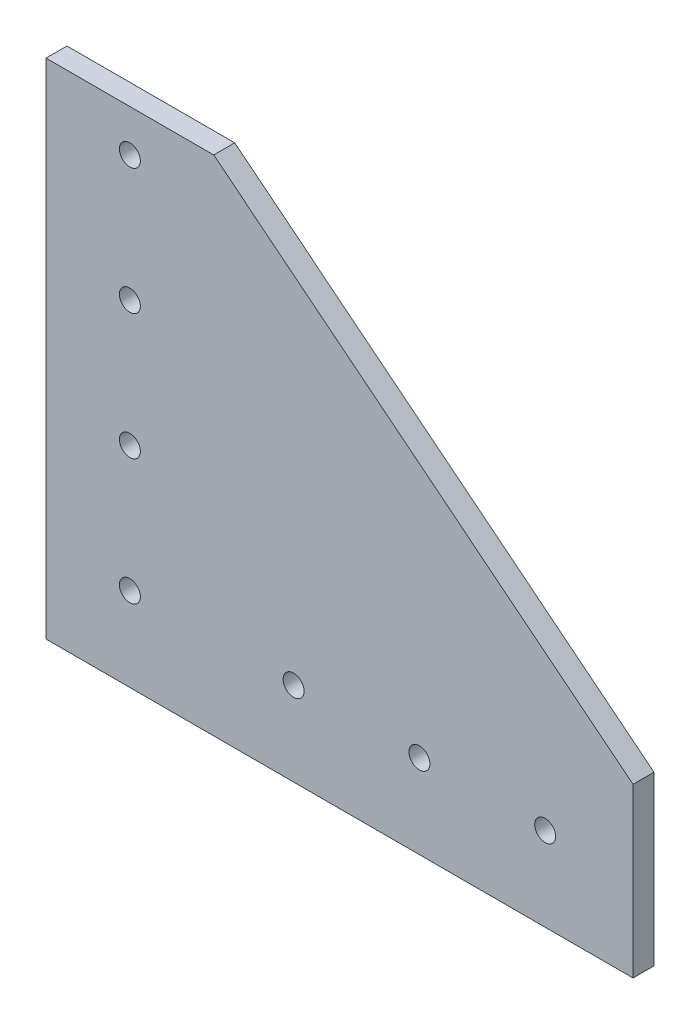
ISO-10303-21;
HEADER;
FILE_DESCRIPTION(('STEP AP214'),'2;1');
FILE_NAME('part.step','',(''),(''),'','','');
FILE_SCHEMA(('AUTOMOTIVE_DESIGN { 1 0 10303 214 1 1 1 1 }'));
ENDSEC;
DATA;
#1=APPLICATION_CONTEXT('core data for automotive mechanical design processes');
#2=APPLICATION_PROTOCOL_DEFINITION('international standard','automotive_design',2000,#1);
#3=PRODUCT_CONTEXT('',#1,'mechanical');
#4=PRODUCT('Part','Part','',(#3));
#5=PRODUCT_RELATED_PRODUCT_CATEGORY('part','',(#4));
#6=PRODUCT_DEFINITION_FORMATION('','',#4);
#7=PRODUCT_DEFINITION_CONTEXT('part definition',#1,'design');
#8=PRODUCT_DEFINITION('design','',#6,#7);
#9=PRODUCT_DEFINITION_SHAPE('','',#8);
#10=(LENGTH_UNIT() NAMED_UNIT(*) SI_UNIT(.MILLI.,.METRE.));
#11=(NAMED_UNIT(*) PLANE_ANGLE_UNIT() SI_UNIT($,.RADIAN.));
#12=(NAMED_UNIT(*) SI_UNIT($,.STERADIAN.) SOLID_ANGLE_UNIT());
#13=UNCERTAINTY_MEASURE_WITH_UNIT(LENGTH_MEASURE(1.E-05),#10,'distance_accuracy_value','');
#14=(GEOMETRIC_REPRESENTATION_CONTEXT(3) GLOBAL_UNCERTAINTY_ASSIGNED_CONTEXT((#13)) GLOBAL_UNIT_ASSIGNED_CONTEXT((#10,
#11,#12)) REPRESENTATION_CONTEXT('',''));
#15=CARTESIAN_POINT('',(0.,0.,0.));
#16=DIRECTION('',(0.,0.,1.));
#17=DIRECTION('',(1.,0.,0.));
#18=AXIS2_PLACEMENT_3D('',#15,#16,#17);
#19=CARTESIAN_POINT('',(-47.9900874948812,-35.0656392901018,3.175));
#20=DIRECTION('',(1.,0.,0.));
#21=DIRECTION('',(0.,1.,0.));
#22=AXIS2_PLACEMENT_3D('',#19,#20,#21);
#23=PLANE('',#22);
#24=DIRECTION('',(0.,-1.,0.));
#25=VECTOR('',#24,1.);
#26=CARTESIAN_POINT('',(-47.9900874948812,-35.0656392901018,0.));
#27=LINE('',#26,#25);
#28=CARTESIAN_POINT('',(-47.9900874948813,41.1343607098982,0.));
#29=VERTEX_POINT('',#28);
#30=CARTESIAN_POINT('',(-47.9900874948812,-35.0656392901018,0.));
#31=VERTEX_POINT('',#30);
#32=EDGE_CURVE('E112',#29,#31,#27,.T.);
#33=ORIENTED_EDGE('',*,*,#32,.T.);
#34=DIRECTION('',(0.,0.,-1.));
#35=VECTOR('',#34,1.);
#36=CARTESIAN_POINT('',(-47.9900874948812,-35.0656392901018,3.175));
#37=LINE('',#36,#35);
#38=CARTESIAN_POINT('',(-47.9900874948812,-35.0656392901018,3.175));
#39=VERTEX_POINT('',#38);
#40=EDGE_CURVE('E11',#39,#31,#37,.T.);
#41=ORIENTED_EDGE('',*,*,#40,.F.);
#42=DIRECTION('',(0.,-1.,0.));
#43=VECTOR('',#42,1.);
#44=CARTESIAN_POINT('',(-47.9900874948812,-35.0656392901018,3.175));
#45=LINE('',#44,#43);
#46=CARTESIAN_POINT('',(-47.9900874948813,41.1343607098982,3.175));
#47=VERTEX_POINT('',#46);
#48=EDGE_CURVE('E121',#47,#39,#45,.T.);
#49=ORIENTED_EDGE('',*,*,#48,.F.);
#50=DIRECTION('',(0.,0.,-1.));
#51=VECTOR('',#50,1.);
#52=CARTESIAN_POINT('',(-47.9900874948813,41.1343607098982,3.175));
#53=LINE('',#52,#51);
#54=EDGE_CURVE('E108',#47,#29,#53,.T.);
#55=ORIENTED_EDGE('',*,*,#54,.T.);
#56=EDGE_LOOP('',(#33,#41,#49,#55));
#57=FACE_BOUND('',#56,.T.);
#58=ADVANCED_FACE('F38',(#57),#23,.F.);
#59=CARTESIAN_POINT('',(-47.9900874948812,-35.0656392901018,3.175));
#60=DIRECTION('',(0.,1.,0.));
#61=DIRECTION('',(0.,0.,1.));
#62=AXIS2_PLACEMENT_3D('',#59,#60,#61);
#63=PLANE('',#62);
#64=DIRECTION('',(1.,0.,0.));
#65=VECTOR('',#64,1.);
#66=CARTESIAN_POINT('',(-47.9900874948812,-35.0656392901018,0.));
#67=LINE('',#66,#65);
#68=CARTESIAN_POINT('',(40.9099125051187,-35.0656392901018,0.));
#69=VERTEX_POINT('',#68);
#70=EDGE_CURVE('E115',#31,#69,#67,.T.);
#71=ORIENTED_EDGE('',*,*,#70,.T.);
#72=DIRECTION('',(0.,0.,-1.));
#73=VECTOR('',#72,1.);
#74=CARTESIAN_POINT('',(40.9099125051187,-35.0656392901018,3.175));
#75=LINE('',#74,#73);
#76=CARTESIAN_POINT('',(40.9099125051187,-35.0656392901018,3.175));
#77=VERTEX_POINT('',#76);
#78=EDGE_CURVE('E46',#77,#69,#75,.T.);
#79=ORIENTED_EDGE('',*,*,#78,.F.);
#80=DIRECTION('',(1.,0.,0.));
#81=VECTOR('',#80,1.);
#82=CARTESIAN_POINT('',(-47.9900874948812,-35.0656392901018,3.175));
#83=LINE('',#82,#81);
#84=EDGE_CURVE('E88',#39,#77,#83,.T.);
#85=ORIENTED_EDGE('',*,*,#84,.F.);
#86=ORIENTED_EDGE('',*,*,#40,.T.);
#87=EDGE_LOOP('',(#71,#79,#85,#86));
#88=FACE_BOUND('',#87,.T.);
#89=ADVANCED_FACE('F141',(#88),#63,.F.);
#90=CARTESIAN_POINT('',(40.9099125051187,-35.0656392901018,3.175));
#91=DIRECTION('',(-1.,0.,0.));
#92=DIRECTION('',(0.,0.,1.));
#93=AXIS2_PLACEMENT_3D('',#90,#91,#92);
#94=PLANE('',#93);
#95=DIRECTION('',(0.,1.,0.));
#96=VECTOR('',#95,1.);
#97=CARTESIAN_POINT('',(40.9099125051187,-35.0656392901018,0.));
#98=LINE('',#97,#96);
#99=CARTESIAN_POINT('',(40.9099125051187,-9.66563929010179,0.));
#100=VERTEX_POINT('',#99);
#101=EDGE_CURVE('E103',#69,#100,#98,.T.);
#102=ORIENTED_EDGE('',*,*,#101,.T.);
#103=DIRECTION('',(0.,0.,-1.));
#104=VECTOR('',#103,1.);
#105=CARTESIAN_POINT('',(40.9099125051187,-9.66563929010179,3.175));
#106=LINE('',#105,#104);
#107=CARTESIAN_POINT('',(40.9099125051187,-9.66563929010179,3.175));
#108=VERTEX_POINT('',#107);
#109=EDGE_CURVE('E100',#108,#100,#106,.T.);
#110=ORIENTED_EDGE('',*,*,#109,.F.);
#111=DIRECTION('',(0.,1.,0.));
#112=VECTOR('',#111,1.);
#113=CARTESIAN_POINT('',(40.9099125051187,-35.0656392901018,3.175));
#114=LINE('',#113,#112);
#115=EDGE_CURVE('E92',#77,#108,#114,.T.);
#116=ORIENTED_EDGE('',*,*,#115,.F.);
#117=ORIENTED_EDGE('',*,*,#78,.T.);
#118=EDGE_LOOP('',(#102,#110,#116,#117));
#119=FACE_BOUND('',#118,.T.);
#120=ADVANCED_FACE('F101',(#119),#94,.F.);
#121=CARTESIAN_POINT('',(-22.5900874948813,41.1343607098982,3.175));
#122=DIRECTION('',(-0.624695047554424,-0.78086880944303,0.));
#123=DIRECTION('',(0.78086880944303,-0.624695047554424,0.));
#124=AXIS2_PLACEMENT_3D('',#121,#122,#123);
#125=PLANE('',#124);
#126=DIRECTION('',(-0.78086880944303,0.624695047554424,0.));
#127=VECTOR('',#126,1.);
#128=CARTESIAN_POINT('',(-22.5900874948813,41.1343607098982,0.));
#129=LINE('',#128,#127);
#130=CARTESIAN_POINT('',(-22.5900874948813,41.1343607098982,0.));
#131=VERTEX_POINT('',#130);
#132=EDGE_CURVE('E74',#100,#131,#129,.T.);
#133=ORIENTED_EDGE('',*,*,#132,.T.);
#134=DIRECTION('',(0.,0.,-1.));
#135=VECTOR('',#134,1.);
#136=CARTESIAN_POINT('',(-22.5900874948813,41.1343607098982,3.175));
#137=LINE('',#136,#135);
#138=CARTESIAN_POINT('',(-22.5900874948813,41.1343607098982,3.175));
#139=VERTEX_POINT('',#138);
#140=EDGE_CURVE('E104',#139,#131,#137,.T.);
#141=ORIENTED_EDGE('',*,*,#140,.F.);
#142=DIRECTION('',(-0.78086880944303,0.624695047554424,0.));
#143=VECTOR('',#142,1.);
#144=CARTESIAN_POINT('',(-22.5900874948813,41.1343607098982,3.175));
#145=LINE('',#144,#143);
#146=EDGE_CURVE('E96',#108,#139,#145,.T.);
#147=ORIENTED_EDGE('',*,*,#146,.F.);
#148=ORIENTED_EDGE('',*,*,#109,.T.);
#149=EDGE_LOOP('',(#133,#141,#147,#148));
#150=FACE_BOUND('',#149,.T.);
#151=ADVANCED_FACE('F106',(#150),#125,.F.);
#152=CARTESIAN_POINT('',(-47.9900874948813,41.1343607098982,3.175));
#153=DIRECTION('',(0.,-1.,0.));
#154=DIRECTION('',(0.,0.,-1.));
#155=AXIS2_PLACEMENT_3D('',#152,#153,#154);
#156=PLANE('',#155);
#157=DIRECTION('',(-1.,0.,0.));
#158=VECTOR('',#157,1.);
#159=CARTESIAN_POINT('',(-47.9900874948813,41.1343607098982,0.));
#160=LINE('',#159,#158);
#161=EDGE_CURVE('E80',#131,#29,#160,.T.);
#162=ORIENTED_EDGE('',*,*,#161,.T.);
#163=ORIENTED_EDGE('',*,*,#54,.F.);
#164=DIRECTION('',(-1.,0.,0.));
#165=VECTOR('',#164,1.);
#166=CARTESIAN_POINT('',(-47.9900874948813,41.1343607098982,3.175));
#167=LINE('',#166,#165);
#168=EDGE_CURVE('E54',#139,#47,#167,.T.);
#169=ORIENTED_EDGE('',*,*,#168,.F.);
#170=ORIENTED_EDGE('',*,*,#140,.T.);
#171=EDGE_LOOP('',(#162,#163,#169,#170));
#172=FACE_BOUND('',#171,.T.);
#173=ADVANCED_FACE('F129',(#172),#156,.F.);
#174=CARTESIAN_POINT('',(0.,0.,3.175));
#175=DIRECTION('',(0.,0.,-1.));
#176=DIRECTION('',(-1.,0.,0.));
#177=AXIS2_PLACEMENT_3D('',#174,#175,#176);
#178=PLANE('',#177);
#179=CARTESIAN_POINT('',(-35.2900874948812,-3.31563929010179,3.175));
#180=DIRECTION('',(0.,0.,-1.));
#181=DIRECTION('',(-1.,0.,0.));
#182=AXIS2_PLACEMENT_3D('',#179,#180,#181);
#183=CIRCLE('',#182,1.5875);
#184=CARTESIAN_POINT('',(-36.8775874948812,-3.31563929010179,3.175));
#185=VERTEX_POINT('',#184);
#186=EDGE_CURVE('E250',#185,#185,#183,.T.);
#187=ORIENTED_EDGE('',*,*,#186,.T.);
#188=EDGE_LOOP('',(#187));
#189=FACE_BOUND('',#188,.T.);
#190=CARTESIAN_POINT('',(-35.2900874948812,15.7343607098982,3.175));
#191=DIRECTION('',(0.,0.,-1.));
#192=DIRECTION('',(-1.,0.,0.));
#193=AXIS2_PLACEMENT_3D('',#190,#191,#192);
#194=CIRCLE('',#193,1.5875);
#195=CARTESIAN_POINT('',(-36.8775874948812,15.7343607098982,3.175));
#196=VERTEX_POINT('',#195);
#197=EDGE_CURVE('E254',#196,#196,#194,.T.);
#198=ORIENTED_EDGE('',*,*,#197,.T.);
#199=EDGE_LOOP('',(#198));
#200=FACE_BOUND('',#199,.T.);
#201=CARTESIAN_POINT('',(-35.2900874948813,34.7843607098982,3.175));
#202=DIRECTION('',(0.,0.,-1.));
#203=DIRECTION('',(-1.,0.,0.));
#204=AXIS2_PLACEMENT_3D('',#201,#202,#203);
#205=CIRCLE('',#204,1.5875);
#206=CARTESIAN_POINT('',(-36.8775874948813,34.7843607098982,3.175));
#207=VERTEX_POINT('',#206);
#208=EDGE_CURVE('E264',#207,#207,#205,.T.);
#209=ORIENTED_EDGE('',*,*,#208,.T.);
#210=EDGE_LOOP('',(#209));
#211=FACE_BOUND('',#210,.T.);
#212=CARTESIAN_POINT('',(-10.4949140256755,-22.3656392901018,3.175));
#213=DIRECTION('',(0.,0.,-1.));
#214=DIRECTION('',(-1.,0.,0.));
#215=AXIS2_PLACEMENT_3D('',#212,#213,#214);
#216=CIRCLE('',#215,1.5875);
#217=CARTESIAN_POINT('',(-12.0824140256755,-22.3656392901018,3.175));
#218=VERTEX_POINT('',#217);
#219=EDGE_CURVE('E270',#218,#218,#216,.T.);
#220=ORIENTED_EDGE('',*,*,#219,.T.);
#221=EDGE_LOOP('',(#220));
#222=FACE_BOUND('',#221,.T.);
#223=CARTESIAN_POINT('',(8.55508597432454,-22.3656392901019,3.175));
#224=DIRECTION('',(0.,0.,-1.));
#225=DIRECTION('',(-1.,0.,0.));
#226=AXIS2_PLACEMENT_3D('',#223,#224,#225);
#227=CIRCLE('',#226,1.5875);
#228=CARTESIAN_POINT('',(6.96758597432454,-22.3656392901019,3.175));
#229=VERTEX_POINT('',#228);
#230=EDGE_CURVE('E276',#229,#229,#227,.T.);
#231=ORIENTED_EDGE('',*,*,#230,.T.);
#232=EDGE_LOOP('',(#231));
#233=FACE_BOUND('',#232,.T.);
#234=CARTESIAN_POINT('',(27.6050859743245,-22.3656392901021,3.175));
#235=DIRECTION('',(0.,0.,-1.));
#236=DIRECTION('',(-1.,0.,0.));
#237=AXIS2_PLACEMENT_3D('',#234,#235,#236);
#238=CIRCLE('',#237,1.5875);
#239=CARTESIAN_POINT('',(26.0175859743245,-22.3656392901021,3.175));
#240=VERTEX_POINT('',#239);
#241=EDGE_CURVE('E282',#240,#240,#238,.T.);
#242=ORIENTED_EDGE('',*,*,#241,.T.);
#243=EDGE_LOOP('',(#242));
#244=FACE_BOUND('',#243,.T.);
#245=CARTESIAN_POINT('',(-35.2900874948812,-22.3656392901018,3.175));
#246=DIRECTION('',(0.,0.,-1.));
#247=DIRECTION('',(-1.,0.,0.));
#248=AXIS2_PLACEMENT_3D('',#245,#246,#247);
#249=CIRCLE('',#248,1.5875);
#250=CARTESIAN_POINT('',(-36.8775874948812,-22.3656392901018,3.175));
#251=VERTEX_POINT('',#250);
#252=EDGE_CURVE('E116',#251,#251,#249,.T.);
#253=ORIENTED_EDGE('',*,*,#252,.T.);
#254=EDGE_LOOP('',(#253));
#255=FACE_BOUND('',#254,.T.);
#256=ORIENTED_EDGE('',*,*,#48,.T.);
#257=ORIENTED_EDGE('',*,*,#84,.T.);
#258=ORIENTED_EDGE('',*,*,#115,.T.);
#259=ORIENTED_EDGE('',*,*,#146,.T.);
#260=ORIENTED_EDGE('',*,*,#168,.T.);
#261=EDGE_LOOP('',(#256,#257,#258,#259,#260));
#262=FACE_BOUND('',#261,.T.);
#263=ADVANCED_FACE('F94',(#189,#200,#211,#222,#233,#244,#255,#262),#178,.F.);
#264=CARTESIAN_POINT('',(0.,0.,0.));
#265=DIRECTION('',(0.,0.,-1.));
#266=DIRECTION('',(-1.,0.,0.));
#267=AXIS2_PLACEMENT_3D('',#264,#265,#266);
#268=PLANE('',#267);
#269=CARTESIAN_POINT('',(-35.2900874948812,-3.31563929010179,0.));
#270=DIRECTION('',(0.,0.,-1.));
#271=DIRECTION('',(-1.,0.,0.));
#272=AXIS2_PLACEMENT_3D('',#269,#270,#271);
#273=CIRCLE('',#272,1.5875);
#274=CARTESIAN_POINT('',(-36.8775874948812,-3.31563929010179,0.));
#275=VERTEX_POINT('',#274);
#276=EDGE_CURVE('E253',#275,#275,#273,.T.);
#277=ORIENTED_EDGE('',*,*,#276,.F.);
#278=EDGE_LOOP('',(#277));
#279=FACE_BOUND('',#278,.T.);
#280=CARTESIAN_POINT('',(-35.2900874948812,15.7343607098982,0.));
#281=DIRECTION('',(0.,0.,-1.));
#282=DIRECTION('',(-1.,0.,0.));
#283=AXIS2_PLACEMENT_3D('',#280,#281,#282);
#284=CIRCLE('',#283,1.5875);
#285=CARTESIAN_POINT('',(-36.8775874948812,15.7343607098982,0.));
#286=VERTEX_POINT('',#285);
#287=EDGE_CURVE('E259',#286,#286,#284,.T.);
#288=ORIENTED_EDGE('',*,*,#287,.F.);
#289=EDGE_LOOP('',(#288));
#290=FACE_BOUND('',#289,.T.);
#291=CARTESIAN_POINT('',(-35.2900874948813,34.7843607098982,0.));
#292=DIRECTION('',(0.,0.,-1.));
#293=DIRECTION('',(-1.,0.,0.));
#294=AXIS2_PLACEMENT_3D('',#291,#292,#293);
#295=CIRCLE('',#294,1.5875);
#296=CARTESIAN_POINT('',(-36.8775874948813,34.7843607098982,0.));
#297=VERTEX_POINT('',#296);
#298=EDGE_CURVE('E267',#297,#297,#295,.T.);
#299=ORIENTED_EDGE('',*,*,#298,.F.);
#300=EDGE_LOOP('',(#299));
#301=FACE_BOUND('',#300,.T.);
#302=CARTESIAN_POINT('',(-10.4949140256755,-22.3656392901018,0.));
#303=DIRECTION('',(0.,0.,-1.));
#304=DIRECTION('',(-1.,0.,0.));
#305=AXIS2_PLACEMENT_3D('',#302,#303,#304);
#306=CIRCLE('',#305,1.5875);
#307=CARTESIAN_POINT('',(-12.0824140256755,-22.3656392901018,0.));
#308=VERTEX_POINT('',#307);
#309=EDGE_CURVE('E273',#308,#308,#306,.T.);
#310=ORIENTED_EDGE('',*,*,#309,.F.);
#311=EDGE_LOOP('',(#310));
#312=FACE_BOUND('',#311,.T.);
#313=CARTESIAN_POINT('',(8.55508597432454,-22.3656392901019,0.));
#314=DIRECTION('',(0.,0.,-1.));
#315=DIRECTION('',(-1.,0.,0.));
#316=AXIS2_PLACEMENT_3D('',#313,#314,#315);
#317=CIRCLE('',#316,1.5875);
#318=CARTESIAN_POINT('',(6.96758597432454,-22.3656392901019,0.));
#319=VERTEX_POINT('',#318);
#320=EDGE_CURVE('E279',#319,#319,#317,.T.);
#321=ORIENTED_EDGE('',*,*,#320,.F.);
#322=EDGE_LOOP('',(#321));
#323=FACE_BOUND('',#322,.T.);
#324=CARTESIAN_POINT('',(27.6050859743245,-22.3656392901021,0.));
#325=DIRECTION('',(0.,0.,-1.));
#326=DIRECTION('',(-1.,0.,0.));
#327=AXIS2_PLACEMENT_3D('',#324,#325,#326);
#328=CIRCLE('',#327,1.5875);
#329=CARTESIAN_POINT('',(26.0175859743245,-22.3656392901021,0.));
#330=VERTEX_POINT('',#329);
#331=EDGE_CURVE('E285',#330,#330,#328,.T.);
#332=ORIENTED_EDGE('',*,*,#331,.F.);
#333=EDGE_LOOP('',(#332));
#334=FACE_BOUND('',#333,.T.);
#335=CARTESIAN_POINT('',(-35.2900874948812,-22.3656392901018,0.));
#336=DIRECTION('',(0.,0.,-1.));
#337=DIRECTION('',(-1.,0.,0.));
#338=AXIS2_PLACEMENT_3D('',#335,#336,#337);
#339=CIRCLE('',#338,1.5875);
#340=CARTESIAN_POINT('',(-36.8775874948812,-22.3656392901018,0.));
#341=VERTEX_POINT('',#340);
#342=EDGE_CURVE('E256',#341,#341,#339,.T.);
#343=ORIENTED_EDGE('',*,*,#342,.F.);
#344=EDGE_LOOP('',(#343));
#345=FACE_BOUND('',#344,.T.);
#346=ORIENTED_EDGE('',*,*,#32,.F.);
#347=ORIENTED_EDGE('',*,*,#161,.F.);
#348=ORIENTED_EDGE('',*,*,#132,.F.);
#349=ORIENTED_EDGE('',*,*,#101,.F.);
#350=ORIENTED_EDGE('',*,*,#70,.F.);
#351=EDGE_LOOP('',(#346,#347,#348,#349,#350));
#352=FACE_BOUND('',#351,.T.);
#353=ADVANCED_FACE('F125',(#279,#290,#301,#312,#323,#334,#345,#352),#268,.T.);
#354=CARTESIAN_POINT('',(-35.2900874948812,-22.3656392901018,3.175));
#355=DIRECTION('',(0.,0.,-1.));
#356=DIRECTION('',(-1.,0.,0.));
#357=AXIS2_PLACEMENT_3D('',#354,#355,#356);
#358=CYLINDRICAL_SURFACE('',#357,1.5875);
#359=ORIENTED_EDGE('',*,*,#252,.F.);
#360=EDGE_LOOP('',(#359));
#361=FACE_BOUND('',#360,.T.);
#362=ORIENTED_EDGE('',*,*,#342,.T.);
#363=EDGE_LOOP('',(#362));
#364=FACE_BOUND('',#363,.T.);
#365=ADVANCED_FACE('F174',(#361,#364),#358,.F.);
#366=CARTESIAN_POINT('',(27.6050859743245,-22.3656392901021,3.175));
#367=DIRECTION('',(0.,0.,-1.));
#368=DIRECTION('',(-1.,0.,0.));
#369=AXIS2_PLACEMENT_3D('',#366,#367,#368);
#370=CYLINDRICAL_SURFACE('',#369,1.5875);
#371=ORIENTED_EDGE('',*,*,#241,.F.);
#372=EDGE_LOOP('',(#371));
#373=FACE_BOUND('',#372,.T.);
#374=ORIENTED_EDGE('',*,*,#331,.T.);
#375=EDGE_LOOP('',(#374));
#376=FACE_BOUND('',#375,.T.);
#377=ADVANCED_FACE('F183',(#373,#376),#370,.F.);
#378=CARTESIAN_POINT('',(8.55508597432454,-22.3656392901019,3.175));
#379=DIRECTION('',(0.,0.,-1.));
#380=DIRECTION('',(-1.,0.,0.));
#381=AXIS2_PLACEMENT_3D('',#378,#379,#380);
#382=CYLINDRICAL_SURFACE('',#381,1.5875);
#383=ORIENTED_EDGE('',*,*,#230,.F.);
#384=EDGE_LOOP('',(#383));
#385=FACE_BOUND('',#384,.T.);
#386=ORIENTED_EDGE('',*,*,#320,.T.);
#387=EDGE_LOOP('',(#386));
#388=FACE_BOUND('',#387,.T.);
#389=ADVANCED_FACE('F193',(#385,#388),#382,.F.);
#390=CARTESIAN_POINT('',(-10.4949140256755,-22.3656392901018,3.175));
#391=DIRECTION('',(0.,0.,-1.));
#392=DIRECTION('',(-1.,0.,0.));
#393=AXIS2_PLACEMENT_3D('',#390,#391,#392);
#394=CYLINDRICAL_SURFACE('',#393,1.5875);
#395=ORIENTED_EDGE('',*,*,#219,.F.);
#396=EDGE_LOOP('',(#395));
#397=FACE_BOUND('',#396,.T.);
#398=ORIENTED_EDGE('',*,*,#309,.T.);
#399=EDGE_LOOP('',(#398));
#400=FACE_BOUND('',#399,.T.);
#401=ADVANCED_FACE('F203',(#397,#400),#394,.F.);
#402=CARTESIAN_POINT('',(-35.2900874948813,34.7843607098982,3.175));
#403=DIRECTION('',(0.,0.,-1.));
#404=DIRECTION('',(-1.,0.,0.));
#405=AXIS2_PLACEMENT_3D('',#402,#403,#404);
#406=CYLINDRICAL_SURFACE('',#405,1.5875);
#407=ORIENTED_EDGE('',*,*,#208,.F.);
#408=EDGE_LOOP('',(#407));
#409=FACE_BOUND('',#408,.T.);
#410=ORIENTED_EDGE('',*,*,#298,.T.);
#411=EDGE_LOOP('',(#410));
#412=FACE_BOUND('',#411,.T.);
#413=ADVANCED_FACE('F213',(#409,#412),#406,.F.);
#414=CARTESIAN_POINT('',(-35.2900874948812,15.7343607098982,3.175));
#415=DIRECTION('',(0.,0.,-1.));
#416=DIRECTION('',(-1.,0.,0.));
#417=AXIS2_PLACEMENT_3D('',#414,#415,#416);
#418=CYLINDRICAL_SURFACE('',#417,1.5875);
#419=ORIENTED_EDGE('',*,*,#197,.F.);
#420=EDGE_LOOP('',(#419));
#421=FACE_BOUND('',#420,.T.);
#422=ORIENTED_EDGE('',*,*,#287,.T.);
#423=EDGE_LOOP('',(#422));
#424=FACE_BOUND('',#423,.T.);
#425=ADVANCED_FACE('F223',(#421,#424),#418,.F.);
#426=CARTESIAN_POINT('',(-35.2900874948812,-3.31563929010179,3.175));
#427=DIRECTION('',(0.,0.,-1.));
#428=DIRECTION('',(-1.,0.,0.));
#429=AXIS2_PLACEMENT_3D('',#426,#427,#428);
#430=CYLINDRICAL_SURFACE('',#429,1.5875);
#431=ORIENTED_EDGE('',*,*,#186,.F.);
#432=EDGE_LOOP('',(#431));
#433=FACE_BOUND('',#432,.T.);
#434=ORIENTED_EDGE('',*,*,#276,.T.);
#435=EDGE_LOOP('',(#434));
#436=FACE_BOUND('',#435,.T.);
#437=ADVANCED_FACE('F233',(#433,#436),#430,.F.);
#438=CLOSED_SHELL('',(#58,#89,#120,#151,#173,#263,#353,#365,#377,#389,#401,#413,#425,#437));
#439=MANIFOLD_SOLID_BREP('B2',#438);
#440=ADVANCED_BREP_SHAPE_REPRESENTATION('',(#18,#439),#14);
#441=SHAPE_DEFINITION_REPRESENTATION(#9,#440);
ENDSEC;
END-ISO-10303-21;
